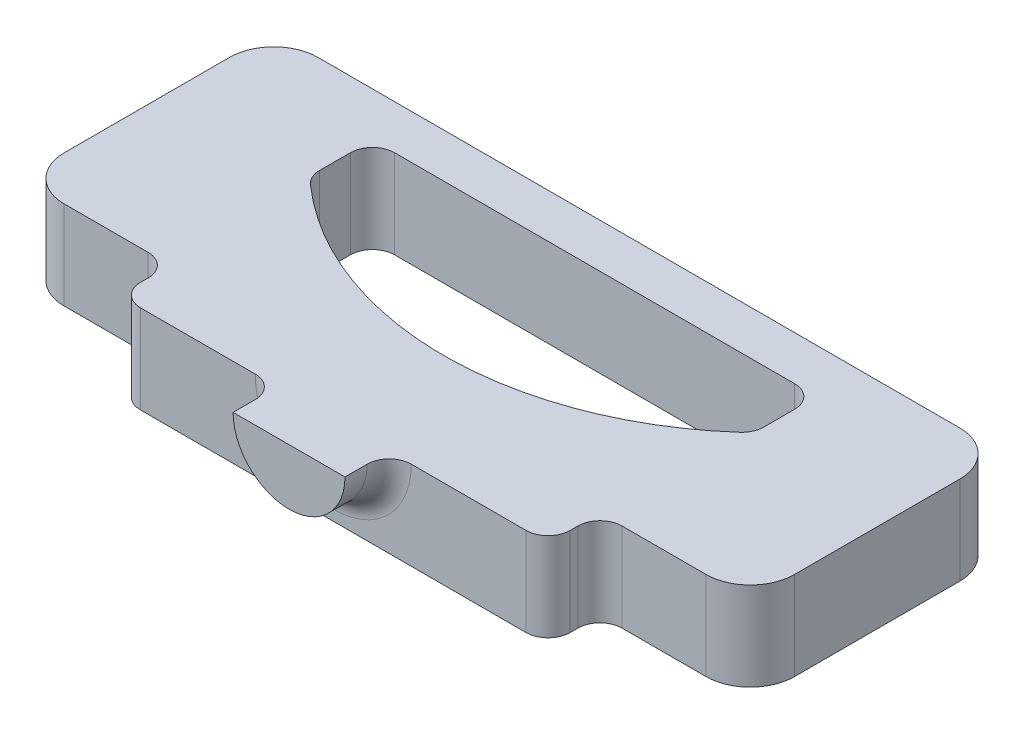
ISO-10303-21;
HEADER;
FILE_DESCRIPTION(('STEP AP214'),'2;1');
FILE_NAME('part.step','',(''),(''),'','','');
FILE_SCHEMA(('AUTOMOTIVE_DESIGN { 1 0 10303 214 1 1 1 1 }'));
ENDSEC;
DATA;
#1=APPLICATION_CONTEXT('core data for automotive mechanical design processes');
#2=APPLICATION_PROTOCOL_DEFINITION('international standard','automotive_design',2000,#1);
#3=PRODUCT_CONTEXT('',#1,'mechanical');
#4=PRODUCT('Part','Part','',(#3));
#5=PRODUCT_RELATED_PRODUCT_CATEGORY('part','',(#4));
#6=PRODUCT_DEFINITION_FORMATION('','',#4);
#7=PRODUCT_DEFINITION_CONTEXT('part definition',#1,'design');
#8=PRODUCT_DEFINITION('design','',#6,#7);
#9=PRODUCT_DEFINITION_SHAPE('','',#8);
#10=(LENGTH_UNIT() NAMED_UNIT(*) SI_UNIT(.MILLI.,.METRE.));
#11=(NAMED_UNIT(*) PLANE_ANGLE_UNIT() SI_UNIT($,.RADIAN.));
#12=(NAMED_UNIT(*) SI_UNIT($,.STERADIAN.) SOLID_ANGLE_UNIT());
#13=UNCERTAINTY_MEASURE_WITH_UNIT(LENGTH_MEASURE(1.E-05),#10,'distance_accuracy_value','');
#14=(GEOMETRIC_REPRESENTATION_CONTEXT(3) GLOBAL_UNCERTAINTY_ASSIGNED_CONTEXT((#13)) GLOBAL_UNIT_ASSIGNED_CONTEXT((#10,
#11,#12)) REPRESENTATION_CONTEXT('',''));
#15=CARTESIAN_POINT('',(0.,0.,0.));
#16=DIRECTION('',(0.,0.,1.));
#17=DIRECTION('',(1.,0.,0.));
#18=AXIS2_PLACEMENT_3D('',#15,#16,#17);
#19=CARTESIAN_POINT('',(24.7518550395749,-12.7,7.44482758620689));
#20=DIRECTION('',(0.,0.,1.));
#21=DIRECTION('',(1.,0.,0.));
#22=AXIS2_PLACEMENT_3D('',#19,#20,#21);
#23=PLANE('',#22);
#24=DIRECTION('',(1.,0.,0.));
#25=VECTOR('',#24,1.);
#26=CARTESIAN_POINT('',(24.7518550395749,0.,7.44482758620689));
#27=LINE('',#26,#25);
#28=CARTESIAN_POINT('',(63.6244780134342,0.,7.44482758620689));
#29=VERTEX_POINT('',#28);
#30=CARTESIAN_POINT('',(80.0875693252892,0.,7.44482758620689));
#31=VERTEX_POINT('',#30);
#32=EDGE_CURVE('E363',#29,#31,#27,.T.);
#33=ORIENTED_EDGE('',*,*,#32,.F.);
#34=CARTESIAN_POINT('',(52.4197121824321,0.,7.44482758620689));
#35=DIRECTION('',(0.,0.,1.));
#36=DIRECTION('',(1.,0.,0.));
#37=AXIS2_PLACEMENT_3D('',#34,#35,#36);
#38=CIRCLE('',#37,11.2047658310022);
#39=CARTESIAN_POINT('',(41.2149463514299,0.,7.44482758620689));
#40=VERTEX_POINT('',#39);
#41=EDGE_CURVE('E46',#29,#40,#38,.F.);
#42=ORIENTED_EDGE('',*,*,#41,.T.);
#43=CARTESIAN_POINT('',(24.7518550395749,0.,7.44482758620689));
#44=VERTEX_POINT('',#43);
#45=EDGE_CURVE('E364',#44,#40,#27,.T.);
#46=ORIENTED_EDGE('',*,*,#45,.F.);
#47=DIRECTION('',(0.,1.,0.));
#48=VECTOR('',#47,1.);
#49=CARTESIAN_POINT('',(24.7518550395749,-12.7,7.44482758620689));
#50=LINE('',#49,#48);
#51=CARTESIAN_POINT('',(24.7518550395749,-12.7,7.44482758620689));
#52=VERTEX_POINT('',#51);
#53=EDGE_CURVE('E408',#52,#44,#50,.T.);
#54=ORIENTED_EDGE('',*,*,#53,.F.);
#55=DIRECTION('',(1.,0.,0.));
#56=VECTOR('',#55,1.);
#57=CARTESIAN_POINT('',(24.7518550395749,-12.7,7.44482758620689));
#58=LINE('',#57,#56);
#59=CARTESIAN_POINT('',(80.0875693252892,-12.7,7.44482758620689));
#60=VERTEX_POINT('',#59);
#61=EDGE_CURVE('E316',#52,#60,#58,.T.);
#62=ORIENTED_EDGE('',*,*,#61,.T.);
#63=DIRECTION('',(0.,1.,0.));
#64=VECTOR('',#63,1.);
#65=CARTESIAN_POINT('',(80.0875693252892,-12.7,7.44482758620689));
#66=LINE('',#65,#64);
#67=EDGE_CURVE('E405',#60,#31,#66,.T.);
#68=ORIENTED_EDGE('',*,*,#67,.T.);
#69=EDGE_LOOP('',(#33,#42,#46,#54,#62,#68));
#70=FACE_BOUND('',#69,.T.);
#71=ADVANCED_FACE('F31',(#70),#23,.T.);
#72=CARTESIAN_POINT('',(6.35,-12.7,-30.0764778325123));
#73=DIRECTION('',(0.,1.,0.));
#74=DIRECTION('',(0.,0.,1.));
#75=AXIS2_PLACEMENT_3D('',#72,#73,#74);
#76=CYLINDRICAL_SURFACE('',#75,6.35);
#77=CARTESIAN_POINT('',(6.35,0.,-30.0764778325123));
#78=DIRECTION('',(0.,1.,0.));
#79=DIRECTION('',(0.,0.,1.));
#80=AXIS2_PLACEMENT_3D('',#77,#78,#79);
#81=CIRCLE('',#80,6.35);
#82=CARTESIAN_POINT('',(6.35000000000004,0.,-36.4264778325123));
#83=VERTEX_POINT('',#82);
#84=CARTESIAN_POINT('',(0.,0.,-30.0764778325123));
#85=VERTEX_POINT('',#84);
#86=EDGE_CURVE('E279',#83,#85,#81,.T.);
#87=ORIENTED_EDGE('',*,*,#86,.F.);
#88=DIRECTION('',(0.,1.,0.));
#89=VECTOR('',#88,1.);
#90=CARTESIAN_POINT('',(6.35000000000004,-12.7,-36.4264778325123));
#91=LINE('',#90,#89);
#92=CARTESIAN_POINT('',(6.35000000000004,-12.7,-36.4264778325123));
#93=VERTEX_POINT('',#92);
#94=EDGE_CURVE('E389',#93,#83,#91,.T.);
#95=ORIENTED_EDGE('',*,*,#94,.F.);
#96=CARTESIAN_POINT('',(6.35,-12.7,-30.0764778325123));
#97=DIRECTION('',(0.,1.,0.));
#98=DIRECTION('',(0.,0.,1.));
#99=AXIS2_PLACEMENT_3D('',#96,#97,#98);
#100=CIRCLE('',#99,6.35);
#101=CARTESIAN_POINT('',(0.,-12.7,-30.0764778325123));
#102=VERTEX_POINT('',#101);
#103=EDGE_CURVE('E294',#93,#102,#100,.T.);
#104=ORIENTED_EDGE('',*,*,#103,.T.);
#105=DIRECTION('',(0.,1.,0.));
#106=VECTOR('',#105,1.);
#107=CARTESIAN_POINT('',(0.,-12.7,-30.0764778325123));
#108=LINE('',#107,#106);
#109=EDGE_CURVE('E343',#102,#85,#108,.T.);
#110=ORIENTED_EDGE('',*,*,#109,.T.);
#111=EDGE_LOOP('',(#87,#95,#104,#110));
#112=FACE_BOUND('',#111,.T.);
#113=ADVANCED_FACE('F425',(#112),#76,.T.);
#114=CARTESIAN_POINT('',(6.35000000000004,-12.7,-36.4264778325123));
#115=DIRECTION('',(0.,0.,-1.));
#116=DIRECTION('',(-1.,0.,0.));
#117=AXIS2_PLACEMENT_3D('',#114,#115,#116);
#118=PLANE('',#117);
#119=DIRECTION('',(-1.,0.,0.));
#120=VECTOR('',#119,1.);
#121=CARTESIAN_POINT('',(6.35000000000004,0.,-36.4264778325123));
#122=LINE('',#121,#120);
#123=CARTESIAN_POINT('',(98.4894243648641,0.,-36.4264778325123));
#124=VERTEX_POINT('',#123);
#125=EDGE_CURVE('E298',#124,#83,#122,.T.);
#126=ORIENTED_EDGE('',*,*,#125,.F.);
#127=DIRECTION('',(0.,1.,0.));
#128=VECTOR('',#127,1.);
#129=CARTESIAN_POINT('',(98.4894243648641,-12.7,-36.4264778325123));
#130=LINE('',#129,#128);
#131=CARTESIAN_POINT('',(98.4894243648641,-12.7,-36.4264778325123));
#132=VERTEX_POINT('',#131);
#133=EDGE_CURVE('E391',#132,#124,#130,.T.);
#134=ORIENTED_EDGE('',*,*,#133,.F.);
#135=DIRECTION('',(-1.,0.,0.));
#136=VECTOR('',#135,1.);
#137=CARTESIAN_POINT('',(6.35000000000004,-12.7,-36.4264778325123));
#138=LINE('',#137,#136);
#139=EDGE_CURVE('E340',#132,#93,#138,.T.);
#140=ORIENTED_EDGE('',*,*,#139,.T.);
#141=ORIENTED_EDGE('',*,*,#94,.T.);
#142=EDGE_LOOP('',(#126,#134,#140,#141));
#143=FACE_BOUND('',#142,.T.);
#144=ADVANCED_FACE('F434',(#143),#118,.T.);
#145=CARTESIAN_POINT('',(98.4894243648642,-12.7,-30.0764778325123));
#146=DIRECTION('',(0.,1.,0.));
#147=DIRECTION('',(0.,0.,1.));
#148=AXIS2_PLACEMENT_3D('',#145,#146,#147);
#149=CYLINDRICAL_SURFACE('',#148,6.35);
#150=CARTESIAN_POINT('',(98.4894243648642,0.,-30.0764778325123));
#151=DIRECTION('',(0.,1.,0.));
#152=DIRECTION('',(0.,0.,1.));
#153=AXIS2_PLACEMENT_3D('',#150,#151,#152);
#154=CIRCLE('',#153,6.35);
#155=CARTESIAN_POINT('',(104.839424364864,0.,-30.0764778325123));
#156=VERTEX_POINT('',#155);
#157=EDGE_CURVE('E384',#156,#124,#154,.T.);
#158=ORIENTED_EDGE('',*,*,#157,.F.);
#159=DIRECTION('',(0.,1.,0.));
#160=VECTOR('',#159,1.);
#161=CARTESIAN_POINT('',(104.839424364864,-12.7,-30.0764778325123));
#162=LINE('',#161,#160);
#163=CARTESIAN_POINT('',(104.839424364864,-12.7,-30.0764778325123));
#164=VERTEX_POINT('',#163);
#165=EDGE_CURVE('E393',#164,#156,#162,.T.);
#166=ORIENTED_EDGE('',*,*,#165,.F.);
#167=CARTESIAN_POINT('',(98.4894243648642,-12.7,-30.0764778325123));
#168=DIRECTION('',(0.,1.,0.));
#169=DIRECTION('',(0.,0.,1.));
#170=AXIS2_PLACEMENT_3D('',#167,#168,#169);
#171=CIRCLE('',#170,6.35);
#172=EDGE_CURVE('E337',#164,#132,#171,.T.);
#173=ORIENTED_EDGE('',*,*,#172,.T.);
#174=ORIENTED_EDGE('',*,*,#133,.T.);
#175=EDGE_LOOP('',(#158,#166,#173,#174));
#176=FACE_BOUND('',#175,.T.);
#177=ADVANCED_FACE('F496',(#176),#149,.T.);
#178=CARTESIAN_POINT('',(104.839424364864,-12.7,-30.0764778325123));
#179=DIRECTION('',(1.,0.,0.));
#180=DIRECTION('',(0.,0.,-1.));
#181=AXIS2_PLACEMENT_3D('',#178,#179,#180);
#182=PLANE('',#181);
#183=DIRECTION('',(0.,0.,-1.));
#184=VECTOR('',#183,1.);
#185=CARTESIAN_POINT('',(104.839424364864,0.,-30.0764778325123));
#186=LINE('',#185,#184);
#187=CARTESIAN_POINT('',(104.839424364864,0.,-6.35000000000004));
#188=VERTEX_POINT('',#187);
#189=EDGE_CURVE('E381',#188,#156,#186,.T.);
#190=ORIENTED_EDGE('',*,*,#189,.F.);
#191=DIRECTION('',(0.,1.,0.));
#192=VECTOR('',#191,1.);
#193=CARTESIAN_POINT('',(104.839424364864,-12.7,-6.35000000000004));
#194=LINE('',#193,#192);
#195=CARTESIAN_POINT('',(104.839424364864,-12.7,-6.35000000000004));
#196=VERTEX_POINT('',#195);
#197=EDGE_CURVE('E395',#196,#188,#194,.T.);
#198=ORIENTED_EDGE('',*,*,#197,.F.);
#199=DIRECTION('',(0.,0.,-1.));
#200=VECTOR('',#199,1.);
#201=CARTESIAN_POINT('',(104.839424364864,-12.7,-30.0764778325123));
#202=LINE('',#201,#200);
#203=EDGE_CURVE('E334',#196,#164,#202,.T.);
#204=ORIENTED_EDGE('',*,*,#203,.T.);
#205=ORIENTED_EDGE('',*,*,#165,.T.);
#206=EDGE_LOOP('',(#190,#198,#204,#205));
#207=FACE_BOUND('',#206,.T.);
#208=ADVANCED_FACE('F499',(#207),#182,.T.);
#209=CARTESIAN_POINT('',(98.4894243648642,-12.7,-6.35));
#210=DIRECTION('',(0.,1.,0.));
#211=DIRECTION('',(0.,0.,1.));
#212=AXIS2_PLACEMENT_3D('',#209,#210,#211);
#213=CYLINDRICAL_SURFACE('',#212,6.35);
#214=CARTESIAN_POINT('',(98.4894243648642,0.,-6.35));
#215=DIRECTION('',(0.,1.,0.));
#216=DIRECTION('',(0.,0.,-1.));
#217=AXIS2_PLACEMENT_3D('',#214,#215,#216);
#218=CIRCLE('',#217,6.35);
#219=CARTESIAN_POINT('',(98.4894243648641,0.,0.));
#220=VERTEX_POINT('',#219);
#221=EDGE_CURVE('E378',#220,#188,#218,.T.);
#222=ORIENTED_EDGE('',*,*,#221,.F.);
#223=DIRECTION('',(0.,1.,0.));
#224=VECTOR('',#223,1.);
#225=CARTESIAN_POINT('',(98.4894243648641,-12.7,0.));
#226=LINE('',#225,#224);
#227=CARTESIAN_POINT('',(98.4894243648641,-12.7,0.));
#228=VERTEX_POINT('',#227);
#229=EDGE_CURVE('E397',#228,#220,#226,.T.);
#230=ORIENTED_EDGE('',*,*,#229,.F.);
#231=CARTESIAN_POINT('',(98.4894243648642,-12.7,-6.35));
#232=DIRECTION('',(0.,1.,0.));
#233=DIRECTION('',(0.,0.,-1.));
#234=AXIS2_PLACEMENT_3D('',#231,#232,#233);
#235=CIRCLE('',#234,6.35);
#236=EDGE_CURVE('E331',#228,#196,#235,.T.);
#237=ORIENTED_EDGE('',*,*,#236,.T.);
#238=ORIENTED_EDGE('',*,*,#197,.T.);
#239=EDGE_LOOP('',(#222,#230,#237,#238));
#240=FACE_BOUND('',#239,.T.);
#241=ADVANCED_FACE('F503',(#240),#213,.T.);
#242=CARTESIAN_POINT('',(98.4894243648641,-12.7,0.));
#243=DIRECTION('',(0.,0.,1.));
#244=DIRECTION('',(1.,0.,0.));
#245=AXIS2_PLACEMENT_3D('',#242,#243,#244);
#246=PLANE('',#245);
#247=DIRECTION('',(1.,0.,0.));
#248=VECTOR('',#247,1.);
#249=CARTESIAN_POINT('',(98.4894243648641,0.,0.));
#250=LINE('',#249,#248);
#251=CARTESIAN_POINT('',(86.4375693252893,0.,0.));
#252=VERTEX_POINT('',#251);
#253=EDGE_CURVE('E375',#252,#220,#250,.T.);
#254=ORIENTED_EDGE('',*,*,#253,.F.);
#255=DIRECTION('',(0.,1.,0.));
#256=VECTOR('',#255,1.);
#257=CARTESIAN_POINT('',(86.4375693252893,-12.7,0.));
#258=LINE('',#257,#256);
#259=CARTESIAN_POINT('',(86.4375693252893,-12.7,0.));
#260=VERTEX_POINT('',#259);
#261=EDGE_CURVE('E399',#260,#252,#258,.T.);
#262=ORIENTED_EDGE('',*,*,#261,.F.);
#263=DIRECTION('',(1.,0.,0.));
#264=VECTOR('',#263,1.);
#265=CARTESIAN_POINT('',(98.4894243648641,-12.7,0.));
#266=LINE('',#265,#264);
#267=EDGE_CURVE('E328',#260,#228,#266,.T.);
#268=ORIENTED_EDGE('',*,*,#267,.T.);
#269=ORIENTED_EDGE('',*,*,#229,.T.);
#270=EDGE_LOOP('',(#254,#262,#268,#269));
#271=FACE_BOUND('',#270,.T.);
#272=ADVANCED_FACE('F507',(#271),#246,.T.);
#273=CARTESIAN_POINT('',(86.4375693252892,-12.7,3.175));
#274=DIRECTION('',(0.,1.,0.));
#275=DIRECTION('',(0.,0.,1.));
#276=AXIS2_PLACEMENT_3D('',#273,#274,#275);
#277=CYLINDRICAL_SURFACE('',#276,3.175);
#278=CARTESIAN_POINT('',(86.4375693252892,0.,3.175));
#279=DIRECTION('',(0.,-1.,0.));
#280=DIRECTION('',(0.,0.,-1.));
#281=AXIS2_PLACEMENT_3D('',#278,#279,#280);
#282=CIRCLE('',#281,3.175);
#283=CARTESIAN_POINT('',(83.2625693252892,0.,3.17500000000003));
#284=VERTEX_POINT('',#283);
#285=EDGE_CURVE('E372',#284,#252,#282,.T.);
#286=ORIENTED_EDGE('',*,*,#285,.F.);
#287=DIRECTION('',(0.,1.,0.));
#288=VECTOR('',#287,1.);
#289=CARTESIAN_POINT('',(83.2625693252892,-12.7,3.17500000000003));
#290=LINE('',#289,#288);
#291=CARTESIAN_POINT('',(83.2625693252892,-12.7,3.17500000000003));
#292=VERTEX_POINT('',#291);
#293=EDGE_CURVE('E401',#292,#284,#290,.T.);
#294=ORIENTED_EDGE('',*,*,#293,.F.);
#295=CARTESIAN_POINT('',(86.4375693252892,-12.7,3.175));
#296=DIRECTION('',(0.,-1.,0.));
#297=DIRECTION('',(0.,0.,-1.));
#298=AXIS2_PLACEMENT_3D('',#295,#296,#297);
#299=CIRCLE('',#298,3.175);
#300=EDGE_CURVE('E325',#292,#260,#299,.T.);
#301=ORIENTED_EDGE('',*,*,#300,.T.);
#302=ORIENTED_EDGE('',*,*,#261,.T.);
#303=EDGE_LOOP('',(#286,#294,#301,#302));
#304=FACE_BOUND('',#303,.T.);
#305=ADVANCED_FACE('F511',(#304),#277,.F.);
#306=CARTESIAN_POINT('',(83.2625693252892,-12.7,3.17500000000003));
#307=DIRECTION('',(1.,0.,0.));
#308=DIRECTION('',(0.,0.,-1.));
#309=AXIS2_PLACEMENT_3D('',#306,#307,#308);
#310=PLANE('',#309);
#311=DIRECTION('',(0.,0.,-1.));
#312=VECTOR('',#311,1.);
#313=CARTESIAN_POINT('',(83.2625693252892,0.,3.17500000000003));
#314=LINE('',#313,#312);
#315=CARTESIAN_POINT('',(83.2625693252892,0.,4.26982758620687));
#316=VERTEX_POINT('',#315);
#317=EDGE_CURVE('E369',#316,#284,#314,.T.);
#318=ORIENTED_EDGE('',*,*,#317,.F.);
#319=DIRECTION('',(0.,1.,0.));
#320=VECTOR('',#319,1.);
#321=CARTESIAN_POINT('',(83.2625693252892,-12.7,4.26982758620687));
#322=LINE('',#321,#320);
#323=CARTESIAN_POINT('',(83.2625693252892,-12.7,4.26982758620687));
#324=VERTEX_POINT('',#323);
#325=EDGE_CURVE('E403',#324,#316,#322,.T.);
#326=ORIENTED_EDGE('',*,*,#325,.F.);
#327=DIRECTION('',(0.,0.,-1.));
#328=VECTOR('',#327,1.);
#329=CARTESIAN_POINT('',(83.2625693252892,-12.7,3.17500000000003));
#330=LINE('',#329,#328);
#331=EDGE_CURVE('E322',#324,#292,#330,.T.);
#332=ORIENTED_EDGE('',*,*,#331,.T.);
#333=ORIENTED_EDGE('',*,*,#293,.T.);
#334=EDGE_LOOP('',(#318,#326,#332,#333));
#335=FACE_BOUND('',#334,.T.);
#336=ADVANCED_FACE('F514',(#335),#310,.T.);
#337=CARTESIAN_POINT('',(80.0875693252893,-12.7,4.26982758620689));
#338=DIRECTION('',(0.,1.,0.));
#339=DIRECTION('',(0.,0.,1.));
#340=AXIS2_PLACEMENT_3D('',#337,#338,#339);
#341=CYLINDRICAL_SURFACE('',#340,3.175);
#342=CARTESIAN_POINT('',(80.0875693252893,0.,4.26982758620689));
#343=DIRECTION('',(0.,1.,0.));
#344=DIRECTION('',(0.,0.,-1.));
#345=AXIS2_PLACEMENT_3D('',#342,#343,#344);
#346=CIRCLE('',#345,3.175);
#347=EDGE_CURVE('E366',#31,#316,#346,.T.);
#348=ORIENTED_EDGE('',*,*,#347,.F.);
#349=ORIENTED_EDGE('',*,*,#67,.F.);
#350=CARTESIAN_POINT('',(80.0875693252893,-12.7,4.26982758620689));
#351=DIRECTION('',(0.,1.,0.));
#352=DIRECTION('',(0.,0.,-1.));
#353=AXIS2_PLACEMENT_3D('',#350,#351,#352);
#354=CIRCLE('',#353,3.175);
#355=EDGE_CURVE('E319',#60,#324,#354,.T.);
#356=ORIENTED_EDGE('',*,*,#355,.T.);
#357=ORIENTED_EDGE('',*,*,#325,.T.);
#358=EDGE_LOOP('',(#348,#349,#356,#357));
#359=FACE_BOUND('',#358,.T.);
#360=ADVANCED_FACE('F467',(#359),#341,.T.);
#361=CARTESIAN_POINT('',(24.7518550395749,-12.7,4.26982758620689));
#362=DIRECTION('',(0.,1.,0.));
#363=DIRECTION('',(0.,0.,1.));
#364=AXIS2_PLACEMENT_3D('',#361,#362,#363);
#365=CYLINDRICAL_SURFACE('',#364,3.175);
#366=CARTESIAN_POINT('',(24.7518550395749,0.,4.26982758620689));
#367=DIRECTION('',(0.,1.,0.));
#368=DIRECTION('',(0.,0.,-1.));
#369=AXIS2_PLACEMENT_3D('',#366,#367,#368);
#370=CIRCLE('',#369,3.175);
#371=CARTESIAN_POINT('',(21.5768550395749,0.,4.26982758620687));
#372=VERTEX_POINT('',#371);
#373=EDGE_CURVE('E360',#372,#44,#370,.T.);
#374=ORIENTED_EDGE('',*,*,#373,.F.);
#375=DIRECTION('',(0.,1.,0.));
#376=VECTOR('',#375,1.);
#377=CARTESIAN_POINT('',(21.5768550395749,-12.7,4.26982758620687));
#378=LINE('',#377,#376);
#379=CARTESIAN_POINT('',(21.5768550395749,-12.7,4.26982758620687));
#380=VERTEX_POINT('',#379);
#381=EDGE_CURVE('E410',#380,#372,#378,.T.);
#382=ORIENTED_EDGE('',*,*,#381,.F.);
#383=CARTESIAN_POINT('',(24.7518550395749,-12.7,4.26982758620689));
#384=DIRECTION('',(0.,1.,0.));
#385=DIRECTION('',(0.,0.,-1.));
#386=AXIS2_PLACEMENT_3D('',#383,#384,#385);
#387=CIRCLE('',#386,3.175);
#388=EDGE_CURVE('E313',#380,#52,#387,.T.);
#389=ORIENTED_EDGE('',*,*,#388,.T.);
#390=ORIENTED_EDGE('',*,*,#53,.T.);
#391=EDGE_LOOP('',(#374,#382,#389,#390));
#392=FACE_BOUND('',#391,.T.);
#393=ADVANCED_FACE('F457',(#392),#365,.T.);
#394=CARTESIAN_POINT('',(21.5768550395749,-12.7,3.17500000000002));
#395=DIRECTION('',(-1.,0.,0.));
#396=DIRECTION('',(0.,0.,1.));
#397=AXIS2_PLACEMENT_3D('',#394,#395,#396);
#398=PLANE('',#397);
#399=DIRECTION('',(0.,0.,1.));
#400=VECTOR('',#399,1.);
#401=CARTESIAN_POINT('',(21.5768550395749,0.,3.17500000000002));
#402=LINE('',#401,#400);
#403=CARTESIAN_POINT('',(21.5768550395749,0.,3.17500000000002));
#404=VERTEX_POINT('',#403);
#405=EDGE_CURVE('E357',#404,#372,#402,.T.);
#406=ORIENTED_EDGE('',*,*,#405,.F.);
#407=DIRECTION('',(0.,1.,0.));
#408=VECTOR('',#407,1.);
#409=CARTESIAN_POINT('',(21.5768550395749,-12.7,3.17500000000002));
#410=LINE('',#409,#408);
#411=CARTESIAN_POINT('',(21.5768550395749,-12.7,3.17500000000002));
#412=VERTEX_POINT('',#411);
#413=EDGE_CURVE('E412',#412,#404,#410,.T.);
#414=ORIENTED_EDGE('',*,*,#413,.F.);
#415=DIRECTION('',(0.,0.,1.));
#416=VECTOR('',#415,1.);
#417=CARTESIAN_POINT('',(21.5768550395749,-12.7,3.17500000000002));
#418=LINE('',#417,#416);
#419=EDGE_CURVE('E310',#412,#380,#418,.T.);
#420=ORIENTED_EDGE('',*,*,#419,.T.);
#421=ORIENTED_EDGE('',*,*,#381,.T.);
#422=EDGE_LOOP('',(#406,#414,#420,#421));
#423=FACE_BOUND('',#422,.T.);
#424=ADVANCED_FACE('F453',(#423),#398,.T.);
#425=CARTESIAN_POINT('',(18.4018550395749,-12.7,3.175));
#426=DIRECTION('',(0.,1.,0.));
#427=DIRECTION('',(0.,0.,1.));
#428=AXIS2_PLACEMENT_3D('',#425,#426,#427);
#429=CYLINDRICAL_SURFACE('',#428,3.175);
#430=CARTESIAN_POINT('',(18.4018550395749,0.,3.175));
#431=DIRECTION('',(0.,-1.,0.));
#432=DIRECTION('',(0.,0.,1.));
#433=AXIS2_PLACEMENT_3D('',#430,#431,#432);
#434=CIRCLE('',#433,3.175);
#435=CARTESIAN_POINT('',(18.4018550395749,0.,0.));
#436=VERTEX_POINT('',#435);
#437=EDGE_CURVE('E354',#436,#404,#434,.T.);
#438=ORIENTED_EDGE('',*,*,#437,.F.);
#439=DIRECTION('',(0.,1.,0.));
#440=VECTOR('',#439,1.);
#441=CARTESIAN_POINT('',(18.4018550395749,-12.7,0.));
#442=LINE('',#441,#440);
#443=CARTESIAN_POINT('',(18.4018550395749,-12.7,0.));
#444=VERTEX_POINT('',#443);
#445=EDGE_CURVE('E414',#444,#436,#442,.T.);
#446=ORIENTED_EDGE('',*,*,#445,.F.);
#447=CARTESIAN_POINT('',(18.4018550395749,-12.7,3.175));
#448=DIRECTION('',(0.,-1.,0.));
#449=DIRECTION('',(0.,0.,1.));
#450=AXIS2_PLACEMENT_3D('',#447,#448,#449);
#451=CIRCLE('',#450,3.175);
#452=EDGE_CURVE('E307',#444,#412,#451,.T.);
#453=ORIENTED_EDGE('',*,*,#452,.T.);
#454=ORIENTED_EDGE('',*,*,#413,.T.);
#455=EDGE_LOOP('',(#438,#446,#453,#454));
#456=FACE_BOUND('',#455,.T.);
#457=ADVANCED_FACE('F449',(#456),#429,.F.);
#458=CARTESIAN_POINT('',(6.35000000000004,-12.7,0.));
#459=DIRECTION('',(0.,0.,1.));
#460=DIRECTION('',(1.,0.,0.));
#461=AXIS2_PLACEMENT_3D('',#458,#459,#460);
#462=PLANE('',#461);
#463=DIRECTION('',(1.,0.,0.));
#464=VECTOR('',#463,1.);
#465=CARTESIAN_POINT('',(6.35000000000004,0.,0.));
#466=LINE('',#465,#464);
#467=CARTESIAN_POINT('',(6.35000000000004,0.,0.));
#468=VERTEX_POINT('',#467);
#469=EDGE_CURVE('E351',#468,#436,#466,.T.);
#470=ORIENTED_EDGE('',*,*,#469,.F.);
#471=DIRECTION('',(0.,1.,0.));
#472=VECTOR('',#471,1.);
#473=CARTESIAN_POINT('',(6.35000000000004,-12.7,0.));
#474=LINE('',#473,#472);
#475=CARTESIAN_POINT('',(6.35000000000004,-12.7,0.));
#476=VERTEX_POINT('',#475);
#477=EDGE_CURVE('E416',#476,#468,#474,.T.);
#478=ORIENTED_EDGE('',*,*,#477,.F.);
#479=DIRECTION('',(1.,0.,0.));
#480=VECTOR('',#479,1.);
#481=CARTESIAN_POINT('',(6.35000000000004,-12.7,0.));
#482=LINE('',#481,#480);
#483=EDGE_CURVE('E304',#476,#444,#482,.T.);
#484=ORIENTED_EDGE('',*,*,#483,.T.);
#485=ORIENTED_EDGE('',*,*,#445,.T.);
#486=EDGE_LOOP('',(#470,#478,#484,#485));
#487=FACE_BOUND('',#486,.T.);
#488=ADVANCED_FACE('F447',(#487),#462,.T.);
#489=CARTESIAN_POINT('',(6.35,-12.7,-6.35));
#490=DIRECTION('',(0.,1.,0.));
#491=DIRECTION('',(0.,0.,1.));
#492=AXIS2_PLACEMENT_3D('',#489,#490,#491);
#493=CYLINDRICAL_SURFACE('',#492,6.35);
#494=CARTESIAN_POINT('',(6.35,0.,-6.35));
#495=DIRECTION('',(0.,1.,0.));
#496=DIRECTION('',(0.,0.,-1.));
#497=AXIS2_PLACEMENT_3D('',#494,#495,#496);
#498=CIRCLE('',#497,6.35);
#499=CARTESIAN_POINT('',(0.,0.,-6.35000000000004));
#500=VERTEX_POINT('',#499);
#501=EDGE_CURVE('E348',#500,#468,#498,.T.);
#502=ORIENTED_EDGE('',*,*,#501,.F.);
#503=DIRECTION('',(0.,1.,0.));
#504=VECTOR('',#503,1.);
#505=CARTESIAN_POINT('',(0.,-12.7,-6.35000000000004));
#506=LINE('',#505,#504);
#507=CARTESIAN_POINT('',(0.,-12.7,-6.35000000000004));
#508=VERTEX_POINT('',#507);
#509=EDGE_CURVE('E418',#508,#500,#506,.T.);
#510=ORIENTED_EDGE('',*,*,#509,.F.);
#511=CARTESIAN_POINT('',(6.35,-12.7,-6.35));
#512=DIRECTION('',(0.,1.,0.));
#513=DIRECTION('',(0.,0.,-1.));
#514=AXIS2_PLACEMENT_3D('',#511,#512,#513);
#515=CIRCLE('',#514,6.35);
#516=EDGE_CURVE('E301',#508,#476,#515,.T.);
#517=ORIENTED_EDGE('',*,*,#516,.T.);
#518=ORIENTED_EDGE('',*,*,#477,.T.);
#519=EDGE_LOOP('',(#502,#510,#517,#518));
#520=FACE_BOUND('',#519,.T.);
#521=ADVANCED_FACE('F443',(#520),#493,.T.);
#522=CARTESIAN_POINT('',(0.,-12.7,-30.0764778325123));
#523=DIRECTION('',(-1.,0.,0.));
#524=DIRECTION('',(0.,0.,1.));
#525=AXIS2_PLACEMENT_3D('',#522,#523,#524);
#526=PLANE('',#525);
#527=DIRECTION('',(0.,0.,1.));
#528=VECTOR('',#527,1.);
#529=CARTESIAN_POINT('',(0.,0.,-30.0764778325123));
#530=LINE('',#529,#528);
#531=EDGE_CURVE('E345',#85,#500,#530,.T.);
#532=ORIENTED_EDGE('',*,*,#531,.F.);
#533=ORIENTED_EDGE('',*,*,#109,.F.);
#534=DIRECTION('',(0.,0.,1.));
#535=VECTOR('',#534,1.);
#536=CARTESIAN_POINT('',(0.,-12.7,-30.0764778325123));
#537=LINE('',#536,#535);
#538=EDGE_CURVE('E297',#102,#508,#537,.T.);
#539=ORIENTED_EDGE('',*,*,#538,.T.);
#540=ORIENTED_EDGE('',*,*,#509,.T.);
#541=EDGE_LOOP('',(#532,#533,#539,#540));
#542=FACE_BOUND('',#541,.T.);
#543=ADVANCED_FACE('F429',(#542),#526,.T.);
#544=CARTESIAN_POINT('',(6.35,-12.7,-30.0764778325123));
#545=DIRECTION('',(0.,1.,0.));
#546=DIRECTION('',(0.,0.,1.));
#547=AXIS2_PLACEMENT_3D('',#544,#545,#546);
#548=PLANE('',#547);
#549=DIRECTION('',(-1.,0.,0.));
#550=VECTOR('',#549,1.);
#551=CARTESIAN_POINT('',(81.1361403438539,-12.7,-30.0764778325123));
#552=LINE('',#551,#550);
#553=CARTESIAN_POINT('',(81.1361403438539,-12.7,-30.0764778325123));
#554=VERTEX_POINT('',#553);
#555=CARTESIAN_POINT('',(23.7032840210103,-12.7,-30.0764778325123));
#556=VERTEX_POINT('',#555);
#557=EDGE_CURVE('E254',#554,#556,#552,.T.);
#558=ORIENTED_EDGE('',*,*,#557,.T.);
#559=CARTESIAN_POINT('',(23.7032840210103,-12.7,-26.9014778325123));
#560=DIRECTION('',(0.,1.,0.));
#561=DIRECTION('',(0.,0.,1.));
#562=AXIS2_PLACEMENT_3D('',#559,#560,#561);
#563=CIRCLE('',#562,3.175);
#564=CARTESIAN_POINT('',(20.5282840210103,-12.7,-26.9014778325123));
#565=VERTEX_POINT('',#564);
#566=EDGE_CURVE('E232',#556,#565,#563,.T.);
#567=ORIENTED_EDGE('',*,*,#566,.T.);
#568=DIRECTION('',(0.,0.,1.));
#569=VECTOR('',#568,1.);
#570=CARTESIAN_POINT('',(20.5282840210103,-12.7,-26.9014778325123));
#571=LINE('',#570,#569);
#572=CARTESIAN_POINT('',(20.5282840210103,-12.7,-22.4769739787726));
#573=VERTEX_POINT('',#572);
#574=EDGE_CURVE('E235',#565,#573,#571,.T.);
#575=ORIENTED_EDGE('',*,*,#574,.T.);
#576=CARTESIAN_POINT('',(23.7032840210103,-12.7,-22.4769739787726));
#577=DIRECTION('',(0.,1.,0.));
#578=DIRECTION('',(0.,0.,1.));
#579=AXIS2_PLACEMENT_3D('',#576,#577,#578);
#580=CIRCLE('',#579,3.175);
#581=CARTESIAN_POINT('',(21.5942729133131,-12.7,-20.10364358719));
#582=VERTEX_POINT('',#581);
#583=EDGE_CURVE('E239',#573,#582,#580,.T.);
#584=ORIENTED_EDGE('',*,*,#583,.T.);
#585=CARTESIAN_POINT('',(52.4197121824321,-12.7,-54.7923901681248));
#586=DIRECTION('',(0.,1.,0.));
#587=DIRECTION('',(0.,0.,1.));
#588=AXIS2_PLACEMENT_3D('',#585,#586,#587);
#589=CIRCLE('',#588,46.4060001022547);
#590=CARTESIAN_POINT('',(83.2451514515511,-12.7,-20.10364358719));
#591=VERTEX_POINT('',#590);
#592=EDGE_CURVE('E242',#582,#591,#589,.T.);
#593=ORIENTED_EDGE('',*,*,#592,.T.);
#594=CARTESIAN_POINT('',(81.1361403438539,-12.7,-22.4769739787726));
#595=DIRECTION('',(0.,1.,0.));
#596=DIRECTION('',(0.,0.,-1.));
#597=AXIS2_PLACEMENT_3D('',#594,#595,#596);
#598=CIRCLE('',#597,3.175);
#599=CARTESIAN_POINT('',(84.3111403438539,-12.7,-22.4769739787726));
#600=VERTEX_POINT('',#599);
#601=EDGE_CURVE('E245',#591,#600,#598,.T.);
#602=ORIENTED_EDGE('',*,*,#601,.T.);
#603=DIRECTION('',(0.,0.,-1.));
#604=VECTOR('',#603,1.);
#605=CARTESIAN_POINT('',(84.3111403438539,-12.7,-26.9014778325123));
#606=LINE('',#605,#604);
#607=CARTESIAN_POINT('',(84.3111403438539,-12.7,-26.9014778325123));
#608=VERTEX_POINT('',#607);
#609=EDGE_CURVE('E248',#600,#608,#606,.T.);
#610=ORIENTED_EDGE('',*,*,#609,.T.);
#611=CARTESIAN_POINT('',(81.1361403438539,-12.7,-26.9014778325123));
#612=DIRECTION('',(0.,1.,0.));
#613=DIRECTION('',(0.,0.,1.));
#614=AXIS2_PLACEMENT_3D('',#611,#612,#613);
#615=CIRCLE('',#614,3.175);
#616=EDGE_CURVE('E251',#608,#554,#615,.T.);
#617=ORIENTED_EDGE('',*,*,#616,.T.);
#618=EDGE_LOOP('',(#558,#567,#575,#584,#593,#602,#610,#617));
#619=FACE_BOUND('',#618,.T.);
#620=ORIENTED_EDGE('',*,*,#103,.F.);
#621=ORIENTED_EDGE('',*,*,#139,.F.);
#622=ORIENTED_EDGE('',*,*,#172,.F.);
#623=ORIENTED_EDGE('',*,*,#203,.F.);
#624=ORIENTED_EDGE('',*,*,#236,.F.);
#625=ORIENTED_EDGE('',*,*,#267,.F.);
#626=ORIENTED_EDGE('',*,*,#300,.F.);
#627=ORIENTED_EDGE('',*,*,#331,.F.);
#628=ORIENTED_EDGE('',*,*,#355,.F.);
#629=ORIENTED_EDGE('',*,*,#61,.F.);
#630=ORIENTED_EDGE('',*,*,#388,.F.);
#631=ORIENTED_EDGE('',*,*,#419,.F.);
#632=ORIENTED_EDGE('',*,*,#452,.F.);
#633=ORIENTED_EDGE('',*,*,#483,.F.);
#634=ORIENTED_EDGE('',*,*,#516,.F.);
#635=ORIENTED_EDGE('',*,*,#538,.F.);
#636=EDGE_LOOP('',(#620,#621,#622,#623,#624,#625,#626,#627,#628,#629,#630,#631,#632,#633,#634,#635));
#637=FACE_BOUND('',#636,.T.);
#638=ADVANCED_FACE('F437',(#619,#637),#548,.F.);
#639=CARTESIAN_POINT('',(6.35,0.,-30.0764778325123));
#640=DIRECTION('',(0.,1.,0.));
#641=DIRECTION('',(0.,0.,1.));
#642=AXIS2_PLACEMENT_3D('',#639,#640,#641);
#643=PLANE('',#642);
#644=CARTESIAN_POINT('',(23.7032840210103,0.,-26.9014778325123));
#645=DIRECTION('',(0.,1.,0.));
#646=DIRECTION('',(0.,0.,1.));
#647=AXIS2_PLACEMENT_3D('',#644,#645,#646);
#648=CIRCLE('',#647,3.175);
#649=CARTESIAN_POINT('',(23.7032840210103,0.,-30.0764778325123));
#650=VERTEX_POINT('',#649);
#651=CARTESIAN_POINT('',(20.5282840210103,0.,-26.9014778325123));
#652=VERTEX_POINT('',#651);
#653=EDGE_CURVE('E226',#650,#652,#648,.T.);
#654=ORIENTED_EDGE('',*,*,#653,.F.);
#655=DIRECTION('',(-1.,0.,0.));
#656=VECTOR('',#655,1.);
#657=CARTESIAN_POINT('',(81.1361403438539,0.,-30.0764778325123));
#658=LINE('',#657,#656);
#659=CARTESIAN_POINT('',(81.1361403438539,0.,-30.0764778325123));
#660=VERTEX_POINT('',#659);
#661=EDGE_CURVE('E236',#660,#650,#658,.T.);
#662=ORIENTED_EDGE('',*,*,#661,.F.);
#663=CARTESIAN_POINT('',(81.1361403438539,0.,-26.9014778325123));
#664=DIRECTION('',(0.,1.,0.));
#665=DIRECTION('',(0.,0.,1.));
#666=AXIS2_PLACEMENT_3D('',#663,#664,#665);
#667=CIRCLE('',#666,3.175);
#668=CARTESIAN_POINT('',(84.3111403438539,0.,-26.9014778325123));
#669=VERTEX_POINT('',#668);
#670=EDGE_CURVE('E272',#669,#660,#667,.T.);
#671=ORIENTED_EDGE('',*,*,#670,.F.);
#672=DIRECTION('',(0.,0.,-1.));
#673=VECTOR('',#672,1.);
#674=CARTESIAN_POINT('',(84.3111403438539,0.,-26.9014778325123));
#675=LINE('',#674,#673);
#676=CARTESIAN_POINT('',(84.3111403438539,0.,-22.4769739787726));
#677=VERTEX_POINT('',#676);
#678=EDGE_CURVE('E269',#677,#669,#675,.T.);
#679=ORIENTED_EDGE('',*,*,#678,.F.);
#680=CARTESIAN_POINT('',(81.1361403438539,0.,-22.4769739787726));
#681=DIRECTION('',(0.,1.,0.));
#682=DIRECTION('',(0.,0.,-1.));
#683=AXIS2_PLACEMENT_3D('',#680,#681,#682);
#684=CIRCLE('',#683,3.175);
#685=CARTESIAN_POINT('',(83.2451514515511,0.,-20.10364358719));
#686=VERTEX_POINT('',#685);
#687=EDGE_CURVE('E266',#686,#677,#684,.T.);
#688=ORIENTED_EDGE('',*,*,#687,.F.);
#689=CARTESIAN_POINT('',(52.4197121824321,0.,-54.7923901681248));
#690=DIRECTION('',(0.,1.,0.));
#691=DIRECTION('',(0.,0.,1.));
#692=AXIS2_PLACEMENT_3D('',#689,#690,#691);
#693=CIRCLE('',#692,46.4060001022547);
#694=CARTESIAN_POINT('',(21.5942729133131,0.,-20.10364358719));
#695=VERTEX_POINT('',#694);
#696=EDGE_CURVE('E263',#695,#686,#693,.T.);
#697=ORIENTED_EDGE('',*,*,#696,.F.);
#698=CARTESIAN_POINT('',(23.7032840210103,0.,-22.4769739787726));
#699=DIRECTION('',(0.,1.,0.));
#700=DIRECTION('',(0.,0.,1.));
#701=AXIS2_PLACEMENT_3D('',#698,#699,#700);
#702=CIRCLE('',#701,3.175);
#703=CARTESIAN_POINT('',(20.5282840210103,0.,-22.4769739787726));
#704=VERTEX_POINT('',#703);
#705=EDGE_CURVE('E260',#704,#695,#702,.T.);
#706=ORIENTED_EDGE('',*,*,#705,.F.);
#707=DIRECTION('',(0.,0.,1.));
#708=VECTOR('',#707,1.);
#709=CARTESIAN_POINT('',(20.5282840210103,0.,-26.9014778325123));
#710=LINE('',#709,#708);
#711=EDGE_CURVE('E228',#652,#704,#710,.T.);
#712=ORIENTED_EDGE('',*,*,#711,.F.);
#713=EDGE_LOOP('',(#654,#662,#671,#679,#688,#697,#706,#712));
#714=FACE_BOUND('',#713,.T.);
#715=ORIENTED_EDGE('',*,*,#86,.T.);
#716=ORIENTED_EDGE('',*,*,#531,.T.);
#717=ORIENTED_EDGE('',*,*,#501,.T.);
#718=ORIENTED_EDGE('',*,*,#469,.T.);
#719=ORIENTED_EDGE('',*,*,#437,.T.);
#720=ORIENTED_EDGE('',*,*,#405,.T.);
#721=ORIENTED_EDGE('',*,*,#373,.T.);
#722=ORIENTED_EDGE('',*,*,#45,.T.);
#723=CARTESIAN_POINT('',(41.2149463514299,0.,10.6198275862069));
#724=DIRECTION('',(0.,1.,0.));
#725=DIRECTION('',(0.,0.,1.));
#726=AXIS2_PLACEMENT_3D('',#723,#724,#725);
#727=CIRCLE('',#726,3.175);
#728=CARTESIAN_POINT('',(44.3899463514299,0.,10.6198275862069));
#729=VERTEX_POINT('',#728);
#730=EDGE_CURVE('E11',#40,#729,#727,.F.);
#731=ORIENTED_EDGE('',*,*,#730,.T.);
#732=DIRECTION('',(0.,0.,-1.));
#733=VECTOR('',#732,1.);
#734=CARTESIAN_POINT('',(44.3899463514299,0.,13.7948275862069));
#735=LINE('',#734,#733);
#736=CARTESIAN_POINT('',(44.3899463514299,0.,13.7948275862069));
#737=VERTEX_POINT('',#736);
#738=EDGE_CURVE('E214',#737,#729,#735,.T.);
#739=ORIENTED_EDGE('',*,*,#738,.F.);
#740=DIRECTION('',(-1.,0.,0.));
#741=VECTOR('',#740,1.);
#742=CARTESIAN_POINT('',(44.3899463514299,0.,13.7948275862069));
#743=LINE('',#742,#741);
#744=CARTESIAN_POINT('',(60.4494780134342,0.,13.7948275862069));
#745=VERTEX_POINT('',#744);
#746=EDGE_CURVE('E207',#745,#737,#743,.T.);
#747=ORIENTED_EDGE('',*,*,#746,.F.);
#748=DIRECTION('',(0.,0.,-1.));
#749=VECTOR('',#748,1.);
#750=CARTESIAN_POINT('',(60.4494780134342,0.,13.7948275862069));
#751=LINE('',#750,#749);
#752=CARTESIAN_POINT('',(60.4494780134342,0.,10.6198275862069));
#753=VERTEX_POINT('',#752);
#754=EDGE_CURVE('E212',#745,#753,#751,.T.);
#755=ORIENTED_EDGE('',*,*,#754,.T.);
#756=CARTESIAN_POINT('',(63.6244780134342,0.,10.6198275862069));
#757=DIRECTION('',(0.,1.,0.));
#758=DIRECTION('',(0.,0.,1.));
#759=AXIS2_PLACEMENT_3D('',#756,#757,#758);
#760=CIRCLE('',#759,3.175);
#761=EDGE_CURVE('E39',#753,#29,#760,.F.);
#762=ORIENTED_EDGE('',*,*,#761,.T.);
#763=ORIENTED_EDGE('',*,*,#32,.T.);
#764=ORIENTED_EDGE('',*,*,#347,.T.);
#765=ORIENTED_EDGE('',*,*,#317,.T.);
#766=ORIENTED_EDGE('',*,*,#285,.T.);
#767=ORIENTED_EDGE('',*,*,#253,.T.);
#768=ORIENTED_EDGE('',*,*,#221,.T.);
#769=ORIENTED_EDGE('',*,*,#189,.T.);
#770=ORIENTED_EDGE('',*,*,#157,.T.);
#771=ORIENTED_EDGE('',*,*,#125,.T.);
#772=EDGE_LOOP('',(#715,#716,#717,#718,#719,#720,#721,#722,#731,#739,#747,#755,#762,#763,#764,
#765,#766,#767,#768,#769,#770,#771));
#773=FACE_BOUND('',#772,.T.);
#774=ADVANCED_FACE('F210',(#714,#773),#643,.T.);
#775=CARTESIAN_POINT('',(23.7032840210103,-12.7,-26.9014778325123));
#776=DIRECTION('',(0.,1.,0.));
#777=DIRECTION('',(0.,0.,1.));
#778=AXIS2_PLACEMENT_3D('',#775,#776,#777);
#779=CYLINDRICAL_SURFACE('',#778,3.175);
#780=ORIENTED_EDGE('',*,*,#653,.T.);
#781=DIRECTION('',(0.,1.,0.));
#782=VECTOR('',#781,1.);
#783=CARTESIAN_POINT('',(20.5282840210103,-12.7,-26.9014778325123));
#784=LINE('',#783,#782);
#785=EDGE_CURVE('E256',#565,#652,#784,.T.);
#786=ORIENTED_EDGE('',*,*,#785,.F.);
#787=ORIENTED_EDGE('',*,*,#566,.F.);
#788=DIRECTION('',(0.,1.,0.));
#789=VECTOR('',#788,1.);
#790=CARTESIAN_POINT('',(23.7032840210103,-12.7,-30.0764778325123));
#791=LINE('',#790,#789);
#792=EDGE_CURVE('E277',#556,#650,#791,.T.);
#793=ORIENTED_EDGE('',*,*,#792,.T.);
#794=EDGE_LOOP('',(#780,#786,#787,#793));
#795=FACE_BOUND('',#794,.T.);
#796=ADVANCED_FACE('F488',(#795),#779,.F.);
#797=CARTESIAN_POINT('',(81.1361403438539,-12.7,-30.0764778325123));
#798=DIRECTION('',(0.,0.,-1.));
#799=DIRECTION('',(-1.,0.,0.));
#800=AXIS2_PLACEMENT_3D('',#797,#798,#799);
#801=PLANE('',#800);
#802=ORIENTED_EDGE('',*,*,#661,.T.);
#803=ORIENTED_EDGE('',*,*,#792,.F.);
#804=ORIENTED_EDGE('',*,*,#557,.F.);
#805=DIRECTION('',(0.,1.,0.));
#806=VECTOR('',#805,1.);
#807=CARTESIAN_POINT('',(81.1361403438539,-12.7,-30.0764778325123));
#808=LINE('',#807,#806);
#809=EDGE_CURVE('E280',#554,#660,#808,.T.);
#810=ORIENTED_EDGE('',*,*,#809,.T.);
#811=EDGE_LOOP('',(#802,#803,#804,#810));
#812=FACE_BOUND('',#811,.T.);
#813=ADVANCED_FACE('F574',(#812),#801,.F.);
#814=CARTESIAN_POINT('',(81.1361403438539,-12.7,-26.9014778325123));
#815=DIRECTION('',(0.,1.,0.));
#816=DIRECTION('',(0.,0.,1.));
#817=AXIS2_PLACEMENT_3D('',#814,#815,#816);
#818=CYLINDRICAL_SURFACE('',#817,3.175);
#819=ORIENTED_EDGE('',*,*,#670,.T.);
#820=ORIENTED_EDGE('',*,*,#809,.F.);
#821=ORIENTED_EDGE('',*,*,#616,.F.);
#822=DIRECTION('',(0.,1.,0.));
#823=VECTOR('',#822,1.);
#824=CARTESIAN_POINT('',(84.3111403438539,-12.7,-26.9014778325123));
#825=LINE('',#824,#823);
#826=EDGE_CURVE('E282',#608,#669,#825,.T.);
#827=ORIENTED_EDGE('',*,*,#826,.T.);
#828=EDGE_LOOP('',(#819,#820,#821,#827));
#829=FACE_BOUND('',#828,.T.);
#830=ADVANCED_FACE('F583',(#829),#818,.F.);
#831=CARTESIAN_POINT('',(84.3111403438539,-12.7,-26.9014778325123));
#832=DIRECTION('',(1.,0.,0.));
#833=DIRECTION('',(0.,0.,-1.));
#834=AXIS2_PLACEMENT_3D('',#831,#832,#833);
#835=PLANE('',#834);
#836=ORIENTED_EDGE('',*,*,#678,.T.);
#837=ORIENTED_EDGE('',*,*,#826,.F.);
#838=ORIENTED_EDGE('',*,*,#609,.F.);
#839=DIRECTION('',(0.,1.,0.));
#840=VECTOR('',#839,1.);
#841=CARTESIAN_POINT('',(84.3111403438539,-12.7,-22.4769739787726));
#842=LINE('',#841,#840);
#843=EDGE_CURVE('E284',#600,#677,#842,.T.);
#844=ORIENTED_EDGE('',*,*,#843,.T.);
#845=EDGE_LOOP('',(#836,#837,#838,#844));
#846=FACE_BOUND('',#845,.T.);
#847=ADVANCED_FACE('F593',(#846),#835,.F.);
#848=CARTESIAN_POINT('',(81.1361403438539,-12.7,-22.4769739787726));
#849=DIRECTION('',(0.,1.,0.));
#850=DIRECTION('',(0.,0.,1.));
#851=AXIS2_PLACEMENT_3D('',#848,#849,#850);
#852=CYLINDRICAL_SURFACE('',#851,3.175);
#853=ORIENTED_EDGE('',*,*,#687,.T.);
#854=ORIENTED_EDGE('',*,*,#843,.F.);
#855=ORIENTED_EDGE('',*,*,#601,.F.);
#856=DIRECTION('',(0.,1.,0.));
#857=VECTOR('',#856,1.);
#858=CARTESIAN_POINT('',(83.2451514515511,-12.7,-20.10364358719));
#859=LINE('',#858,#857);
#860=EDGE_CURVE('E286',#591,#686,#859,.T.);
#861=ORIENTED_EDGE('',*,*,#860,.T.);
#862=EDGE_LOOP('',(#853,#854,#855,#861));
#863=FACE_BOUND('',#862,.T.);
#864=ADVANCED_FACE('F603',(#863),#852,.F.);
#865=CARTESIAN_POINT('',(52.4197121824321,-12.7,-54.7923901681248));
#866=DIRECTION('',(0.,1.,0.));
#867=DIRECTION('',(0.,0.,1.));
#868=AXIS2_PLACEMENT_3D('',#865,#866,#867);
#869=CYLINDRICAL_SURFACE('',#868,46.4060001022547);
#870=ORIENTED_EDGE('',*,*,#696,.T.);
#871=ORIENTED_EDGE('',*,*,#860,.F.);
#872=ORIENTED_EDGE('',*,*,#592,.F.);
#873=DIRECTION('',(0.,1.,0.));
#874=VECTOR('',#873,1.);
#875=CARTESIAN_POINT('',(21.5942729133131,-12.7,-20.10364358719));
#876=LINE('',#875,#874);
#877=EDGE_CURVE('E288',#582,#695,#876,.T.);
#878=ORIENTED_EDGE('',*,*,#877,.T.);
#879=EDGE_LOOP('',(#870,#871,#872,#878));
#880=FACE_BOUND('',#879,.T.);
#881=ADVANCED_FACE('F613',(#880),#869,.F.);
#882=CARTESIAN_POINT('',(23.7032840210103,-12.7,-22.4769739787726));
#883=DIRECTION('',(0.,1.,0.));
#884=DIRECTION('',(0.,0.,1.));
#885=AXIS2_PLACEMENT_3D('',#882,#883,#884);
#886=CYLINDRICAL_SURFACE('',#885,3.175);
#887=ORIENTED_EDGE('',*,*,#705,.T.);
#888=ORIENTED_EDGE('',*,*,#877,.F.);
#889=ORIENTED_EDGE('',*,*,#583,.F.);
#890=DIRECTION('',(0.,1.,0.));
#891=VECTOR('',#890,1.);
#892=CARTESIAN_POINT('',(20.5282840210103,-12.7,-22.4769739787726));
#893=LINE('',#892,#891);
#894=EDGE_CURVE('E290',#573,#704,#893,.T.);
#895=ORIENTED_EDGE('',*,*,#894,.T.);
#896=EDGE_LOOP('',(#887,#888,#889,#895));
#897=FACE_BOUND('',#896,.T.);
#898=ADVANCED_FACE('F623',(#897),#886,.F.);
#899=CARTESIAN_POINT('',(20.5282840210103,-12.7,-26.9014778325123));
#900=DIRECTION('',(-1.,0.,0.));
#901=DIRECTION('',(0.,0.,1.));
#902=AXIS2_PLACEMENT_3D('',#899,#900,#901);
#903=PLANE('',#902);
#904=ORIENTED_EDGE('',*,*,#711,.T.);
#905=ORIENTED_EDGE('',*,*,#894,.F.);
#906=ORIENTED_EDGE('',*,*,#574,.F.);
#907=ORIENTED_EDGE('',*,*,#785,.T.);
#908=EDGE_LOOP('',(#904,#905,#906,#907));
#909=FACE_BOUND('',#908,.T.);
#910=ADVANCED_FACE('F633',(#909),#903,.F.);
#911=CARTESIAN_POINT('',(52.4197121824321,0.,13.7948275862069));
#912=DIRECTION('',(0.,0.,-1.));
#913=DIRECTION('',(-1.,0.,0.));
#914=AXIS2_PLACEMENT_3D('',#911,#912,#913);
#915=CYLINDRICAL_SURFACE('',#914,8.02976583100217);
#916=ORIENTED_EDGE('',*,*,#738,.T.);
#917=CARTESIAN_POINT('',(52.4197121824321,0.,10.6198275862069));
#918=DIRECTION('',(0.,0.,1.));
#919=DIRECTION('',(1.,0.,0.));
#920=AXIS2_PLACEMENT_3D('',#917,#918,#919);
#921=CIRCLE('',#920,8.02976583100217);
#922=EDGE_CURVE('E225',#729,#753,#921,.T.);
#923=ORIENTED_EDGE('',*,*,#922,.T.);
#924=ORIENTED_EDGE('',*,*,#754,.F.);
#925=CARTESIAN_POINT('',(52.4197121824321,0.,13.7948275862069));
#926=DIRECTION('',(0.,0.,1.));
#927=DIRECTION('',(1.,0.,0.));
#928=AXIS2_PLACEMENT_3D('',#925,#926,#927);
#929=CIRCLE('',#928,8.02976583100217);
#930=EDGE_CURVE('E217',#737,#745,#929,.T.);
#931=ORIENTED_EDGE('',*,*,#930,.F.);
#932=EDGE_LOOP('',(#916,#923,#924,#931));
#933=FACE_BOUND('',#932,.T.);
#934=ADVANCED_FACE('F223',(#933),#915,.T.);
#935=CARTESIAN_POINT('',(52.4197121824321,0.,13.7948275862069));
#936=DIRECTION('',(0.,0.,1.));
#937=DIRECTION('',(1.,0.,0.));
#938=AXIS2_PLACEMENT_3D('',#935,#936,#937);
#939=PLANE('',#938);
#940=ORIENTED_EDGE('',*,*,#930,.T.);
#941=ORIENTED_EDGE('',*,*,#746,.T.);
#942=EDGE_LOOP('',(#940,#941));
#943=FACE_BOUND('',#942,.T.);
#944=ADVANCED_FACE('F219',(#943),#939,.T.);
#945=CARTESIAN_POINT('',(52.4197121824321,0.,10.6198275862069));
#946=DIRECTION('',(0.,0.,1.));
#947=DIRECTION('',(1.,0.,0.));
#948=AXIS2_PLACEMENT_3D('',#945,#946,#947);
#949=TOROIDAL_SURFACE('',#948,11.2047658310022,3.175);
#950=ORIENTED_EDGE('',*,*,#730,.F.);
#951=ORIENTED_EDGE('',*,*,#41,.F.);
#952=ORIENTED_EDGE('',*,*,#761,.F.);
#953=ORIENTED_EDGE('',*,*,#922,.F.);
#954=EDGE_LOOP('',(#950,#951,#952,#953));
#955=FACE_BOUND('',#954,.T.);
#956=ADVANCED_FACE('F33',(#955),#949,.F.);
#957=CLOSED_SHELL('',(#71,#113,#144,#177,#208,#241,#272,#305,#336,#360,#393,#424,#457,#488,#521,
#543,#638,#774,#796,#813,#830,#847,#864,#881,#898,#910,#934,#944,#956));
#958=MANIFOLD_SOLID_BREP('B2',#957);
#959=ADVANCED_BREP_SHAPE_REPRESENTATION('',(#18,#958),#14);
#960=SHAPE_DEFINITION_REPRESENTATION(#9,#959);
ENDSEC;
END-ISO-10303-21;
